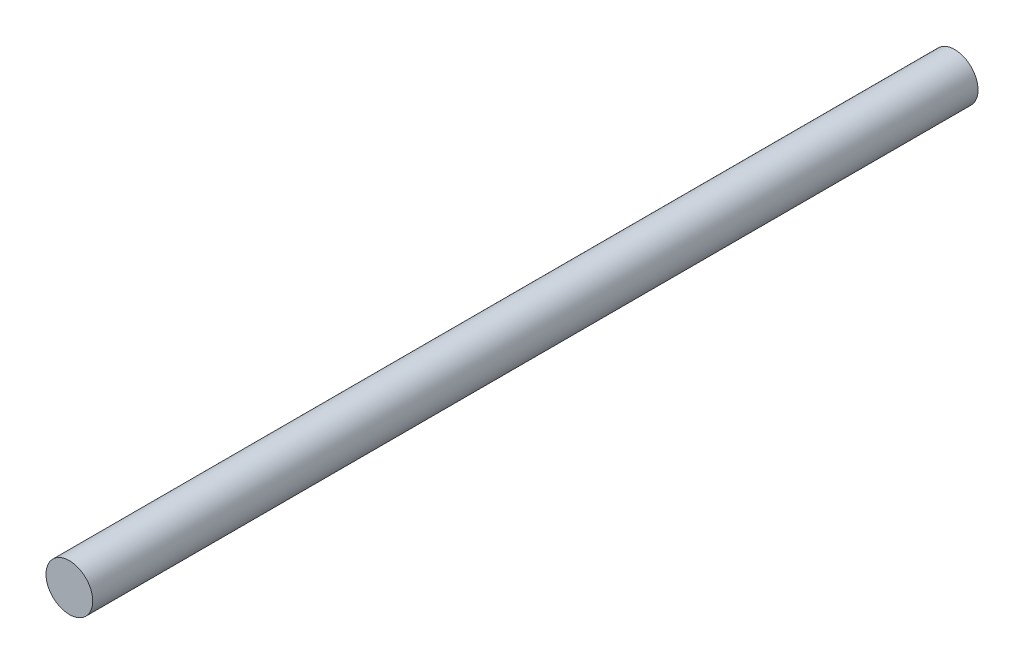
ISO-10303-21;
HEADER;
FILE_DESCRIPTION(('STEP AP214'),'2;1');
FILE_NAME('part.step','',(''),(''),'','','');
FILE_SCHEMA(('AUTOMOTIVE_DESIGN { 1 0 10303 214 1 1 1 1 }'));
ENDSEC;
DATA;
#1=APPLICATION_CONTEXT('core data for automotive mechanical design processes');
#2=APPLICATION_PROTOCOL_DEFINITION('international standard','automotive_design',2000,#1);
#3=PRODUCT_CONTEXT('',#1,'mechanical');
#4=PRODUCT('Part','Part','',(#3));
#5=PRODUCT_RELATED_PRODUCT_CATEGORY('part','',(#4));
#6=PRODUCT_DEFINITION_FORMATION('','',#4);
#7=PRODUCT_DEFINITION_CONTEXT('part definition',#1,'design');
#8=PRODUCT_DEFINITION('design','',#6,#7);
#9=PRODUCT_DEFINITION_SHAPE('','',#8);
#10=(LENGTH_UNIT() NAMED_UNIT(*) SI_UNIT(.MILLI.,.METRE.));
#11=(NAMED_UNIT(*) PLANE_ANGLE_UNIT() SI_UNIT($,.RADIAN.));
#12=(NAMED_UNIT(*) SI_UNIT($,.STERADIAN.) SOLID_ANGLE_UNIT());
#13=UNCERTAINTY_MEASURE_WITH_UNIT(LENGTH_MEASURE(1.E-05),#10,'distance_accuracy_value','');
#14=(GEOMETRIC_REPRESENTATION_CONTEXT(3) GLOBAL_UNCERTAINTY_ASSIGNED_CONTEXT((#13)) GLOBAL_UNIT_ASSIGNED_CONTEXT((#10,
#11,#12)) REPRESENTATION_CONTEXT('',''));
#15=CARTESIAN_POINT('',(0.,0.,0.));
#16=DIRECTION('',(0.,0.,1.));
#17=DIRECTION('',(1.,0.,0.));
#18=AXIS2_PLACEMENT_3D('',#15,#16,#17);
#19=CARTESIAN_POINT('',(0.,0.,113.7));
#20=DIRECTION('',(0.,0.,-1.));
#21=DIRECTION('',(-1.,0.,0.));
#22=AXIS2_PLACEMENT_3D('',#19,#20,#21);
#23=CYLINDRICAL_SURFACE('',#22,3.);
#24=CARTESIAN_POINT('',(0.,0.,113.7));
#25=DIRECTION('',(0.,0.,1.));
#26=DIRECTION('',(1.,0.,0.));
#27=AXIS2_PLACEMENT_3D('',#24,#25,#26);
#28=CIRCLE('',#27,3.);
#29=CARTESIAN_POINT('',(-3.,0.,113.7));
#30=VERTEX_POINT('',#29);
#31=EDGE_CURVE('E10',#30,#30,#28,.T.);
#32=CARTESIAN_POINT('',(0.,0.,0.));
#33=DIRECTION('',(0.,0.,1.));
#34=DIRECTION('',(1.,0.,0.));
#35=AXIS2_PLACEMENT_3D('',#32,#33,#34);
#36=CIRCLE('',#35,3.);
#37=CARTESIAN_POINT('',(-3.,0.,0.));
#38=VERTEX_POINT('',#37);
#39=EDGE_CURVE('E35',#38,#38,#36,.T.);
#40=CARTESIAN_POINT('',(-3.,0.,113.7));
#41=CARTESIAN_POINT('',(-3.,0.,112.515625));
#42=CARTESIAN_POINT('',(-3.,0.,111.33125));
#43=CARTESIAN_POINT('',(-3.,0.,108.9625));
#44=CARTESIAN_POINT('',(-3.,0.,107.778125));
#45=CARTESIAN_POINT('',(-3.,0.,105.409375));
#46=CARTESIAN_POINT('',(-3.,0.,104.225));
#47=CARTESIAN_POINT('',(-3.,0.,101.85625));
#48=CARTESIAN_POINT('',(-3.,0.,100.671875));
#49=CARTESIAN_POINT('',(-3.,0.,98.303125));
#50=CARTESIAN_POINT('',(-3.,0.,97.11875));
#51=CARTESIAN_POINT('',(-3.,0.,94.75));
#52=CARTESIAN_POINT('',(-3.,0.,93.565625));
#53=CARTESIAN_POINT('',(-3.,0.,91.196875));
#54=CARTESIAN_POINT('',(-3.,0.,90.0125));
#55=CARTESIAN_POINT('',(-3.,0.,87.64375));
#56=CARTESIAN_POINT('',(-3.,0.,86.459375));
#57=CARTESIAN_POINT('',(-3.,0.,84.090625));
#58=CARTESIAN_POINT('',(-3.,0.,82.90625));
#59=CARTESIAN_POINT('',(-3.,0.,80.5375));
#60=CARTESIAN_POINT('',(-3.,0.,79.353125));
#61=CARTESIAN_POINT('',(-3.,0.,76.984375));
#62=CARTESIAN_POINT('',(-3.,0.,75.8));
#63=CARTESIAN_POINT('',(-3.,0.,73.43125));
#64=CARTESIAN_POINT('',(-3.,0.,72.246875));
#65=CARTESIAN_POINT('',(-3.,0.,69.878125));
#66=CARTESIAN_POINT('',(-3.,0.,68.69375));
#67=CARTESIAN_POINT('',(-3.,0.,66.325));
#68=CARTESIAN_POINT('',(-3.,0.,65.140625));
#69=CARTESIAN_POINT('',(-3.,0.,62.771875));
#70=CARTESIAN_POINT('',(-3.,0.,61.5875));
#71=CARTESIAN_POINT('',(-3.,0.,59.21875));
#72=CARTESIAN_POINT('',(-3.,0.,58.034375));
#73=CARTESIAN_POINT('',(-3.,0.,55.665625));
#74=CARTESIAN_POINT('',(-3.,0.,54.48125));
#75=CARTESIAN_POINT('',(-3.,0.,52.1125));
#76=CARTESIAN_POINT('',(-3.,0.,50.928125));
#77=CARTESIAN_POINT('',(-3.,0.,48.559375));
#78=CARTESIAN_POINT('',(-3.,0.,47.375));
#79=CARTESIAN_POINT('',(-3.,0.,45.00625));
#80=CARTESIAN_POINT('',(-3.,0.,43.821875));
#81=CARTESIAN_POINT('',(-3.,0.,41.453125));
#82=CARTESIAN_POINT('',(-3.,0.,40.26875));
#83=CARTESIAN_POINT('',(-3.,0.,37.9));
#84=CARTESIAN_POINT('',(-3.,0.,36.715625));
#85=CARTESIAN_POINT('',(-3.,0.,34.346875));
#86=CARTESIAN_POINT('',(-3.,0.,33.1625));
#87=CARTESIAN_POINT('',(-3.,0.,30.79375));
#88=CARTESIAN_POINT('',(-3.,0.,29.609375));
#89=CARTESIAN_POINT('',(-3.,0.,27.240625));
#90=CARTESIAN_POINT('',(-3.,0.,26.05625));
#91=CARTESIAN_POINT('',(-3.,0.,23.6875));
#92=CARTESIAN_POINT('',(-3.,0.,22.503125));
#93=CARTESIAN_POINT('',(-3.,0.,20.134375));
#94=CARTESIAN_POINT('',(-3.,0.,18.95));
#95=CARTESIAN_POINT('',(-3.,0.,16.58125));
#96=CARTESIAN_POINT('',(-3.,0.,15.396875));
#97=CARTESIAN_POINT('',(-3.,0.,13.028125));
#98=CARTESIAN_POINT('',(-3.,0.,11.84375));
#99=CARTESIAN_POINT('',(-3.,0.,9.47499999999999));
#100=CARTESIAN_POINT('',(-3.,0.,8.29062499999999));
#101=CARTESIAN_POINT('',(-3.,0.,5.92187499999999));
#102=CARTESIAN_POINT('',(-3.,0.,4.73749999999999));
#103=CARTESIAN_POINT('',(-3.,0.,2.36874999999999));
#104=CARTESIAN_POINT('',(-3.,0.,1.18437499999999));
#105=CARTESIAN_POINT('',(-3.,0.,0.));
#106=B_SPLINE_CURVE_WITH_KNOTS('',3,(#40,#41,#42,#43,#44,#45,#46,#47,#48,#49,#50,#51,#52,#53,
#54,#55,#56,#57,#58,#59,#60,#61,#62,#63,#64,#65,#66,#67,#68,#69,#70,#71,#72,#73,#74,#75,#76,#77,
#78,#79,#80,#81,#82,#83,#84,#85,#86,#87,#88,#89,#90,#91,#92,#93,#94,#95,#96,#97,#98,#99,#100,
#101,#102,#103,#104,#105),.UNSPECIFIED.,.F.,.F.,(4,2,2,2,2,2,2,2,2,2,2,2,2,2,2,2,2,2,2,2,2,2,2,
2,2,2,2,2,2,2,2,2,4),(0.,3.553125,7.10625000000001,10.659375,14.2125,17.765625,21.31875,
24.871875,28.425,31.978125,35.53125,39.084375,42.6375,46.190625,49.74375,53.296875,56.85,
60.403125,63.95625,67.509375,71.0625,74.615625,78.16875,81.721875,85.275,88.828125,92.38125,
95.934375,99.4875,103.040625,106.59375,110.146875,113.7),.UNSPECIFIED.);
#107=EDGE_CURVE('BSEAM32',#30,#38,#106,.T.);
#108=ORIENTED_EDGE('',*,*,#31,.F.);
#109=ORIENTED_EDGE('',*,*,#39,.T.);
#110=ORIENTED_EDGE('',*,*,#107,.T.);
#111=ORIENTED_EDGE('',*,*,#107,.F.);
#112=EDGE_LOOP('',(#108,#110,#109,#111));
#113=FACE_BOUND('',#112,.T.);
#114=ADVANCED_FACE('F32',(#113),#23,.T.);
#115=CARTESIAN_POINT('',(0.,0.,113.7));
#116=DIRECTION('',(0.,0.,1.));
#117=DIRECTION('',(1.,0.,0.));
#118=AXIS2_PLACEMENT_3D('',#115,#116,#117);
#119=PLANE('',#118);
#120=ORIENTED_EDGE('',*,*,#31,.T.);
#121=EDGE_LOOP('',(#120));
#122=FACE_BOUND('',#121,.T.);
#123=ADVANCED_FACE('F47',(#122),#119,.T.);
#124=CARTESIAN_POINT('',(0.,0.,0.));
#125=DIRECTION('',(0.,0.,1.));
#126=DIRECTION('',(1.,0.,0.));
#127=AXIS2_PLACEMENT_3D('',#124,#125,#126);
#128=PLANE('',#127);
#129=ORIENTED_EDGE('',*,*,#39,.F.);
#130=EDGE_LOOP('',(#129));
#131=FACE_BOUND('',#130,.T.);
#132=ADVANCED_FACE('F45',(#131),#128,.F.);
#133=CLOSED_SHELL('',(#114,#123,#132));
#134=MANIFOLD_SOLID_BREP('B2',#133);
#135=ADVANCED_BREP_SHAPE_REPRESENTATION('',(#18,#134),#14);
#136=SHAPE_DEFINITION_REPRESENTATION(#9,#135);
ENDSEC;
END-ISO-10303-21;
